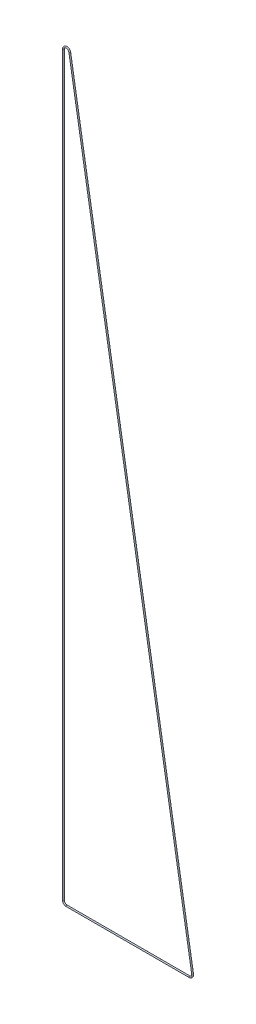
ISO-10303-21;
HEADER;
FILE_DESCRIPTION(('STEP AP214'),'2;1');
FILE_NAME('part.step','',(''),(''),'','','');
FILE_SCHEMA(('AUTOMOTIVE_DESIGN { 1 0 10303 214 1 1 1 1 }'));
ENDSEC;
DATA;
#1=APPLICATION_CONTEXT('core data for automotive mechanical design processes');
#2=APPLICATION_PROTOCOL_DEFINITION('international standard','automotive_design',2000,#1);
#3=PRODUCT_CONTEXT('',#1,'mechanical');
#4=PRODUCT('Part','Part','',(#3));
#5=PRODUCT_RELATED_PRODUCT_CATEGORY('part','',(#4));
#6=PRODUCT_DEFINITION_FORMATION('','',#4);
#7=PRODUCT_DEFINITION_CONTEXT('part definition',#1,'design');
#8=PRODUCT_DEFINITION('design','',#6,#7);
#9=PRODUCT_DEFINITION_SHAPE('','',#8);
#10=(LENGTH_UNIT() NAMED_UNIT(*) SI_UNIT(.MILLI.,.METRE.));
#11=(NAMED_UNIT(*) PLANE_ANGLE_UNIT() SI_UNIT($,.RADIAN.));
#12=(NAMED_UNIT(*) SI_UNIT($,.STERADIAN.) SOLID_ANGLE_UNIT());
#13=UNCERTAINTY_MEASURE_WITH_UNIT(LENGTH_MEASURE(1.E-05),#10,'distance_accuracy_value','');
#14=(GEOMETRIC_REPRESENTATION_CONTEXT(3) GLOBAL_UNCERTAINTY_ASSIGNED_CONTEXT((#13)) GLOBAL_UNIT_ASSIGNED_CONTEXT((#10,
#11,#12)) REPRESENTATION_CONTEXT('',''));
#15=CARTESIAN_POINT('',(0.,0.,0.));
#16=DIRECTION('',(0.,0.,1.));
#17=DIRECTION('',(1.,0.,0.));
#18=AXIS2_PLACEMENT_3D('',#15,#16,#17);
#19=CARTESIAN_POINT('',(388.195395782836,0.,0.));
#20=DIRECTION('',(-1.,0.,0.));
#21=DIRECTION('',(0.,-1.,0.));
#22=AXIS2_PLACEMENT_3D('',#19,#20,#21);
#23=CYLINDRICAL_SURFACE('',#22,2.);
#24=CARTESIAN_POINT('',(388.195395782836,0.,0.));
#25=DIRECTION('',(1.,-1.07555631068124E-12,0.));
#26=DIRECTION('',(0.,0.,-1.));
#27=AXIS2_PLACEMENT_3D('',#24,#25,#26);
#28=CIRCLE('',#27,2.);
#29=CARTESIAN_POINT('',(388.195395782836,-1.99999999999998,0.));
#30=VERTEX_POINT('',#29);
#31=EDGE_CURVE('E38',#30,#30,#28,.T.);
#32=ORIENTED_EDGE('',*,*,#31,.F.);
#33=EDGE_LOOP('',(#32));
#34=FACE_BOUND('',#33,.T.);
#35=CARTESIAN_POINT('',(9.99999999999995,0.,0.));
#36=DIRECTION('',(1.,0.,0.));
#37=DIRECTION('',(0.,0.,-1.));
#38=AXIS2_PLACEMENT_3D('',#35,#36,#37);
#39=CIRCLE('',#38,2.);
#40=CARTESIAN_POINT('',(9.99999999999995,0.,-2.));
#41=VERTEX_POINT('',#40);
#42=EDGE_CURVE('E10',#41,#41,#39,.T.);
#43=ORIENTED_EDGE('',*,*,#42,.T.);
#44=EDGE_LOOP('',(#43));
#45=FACE_BOUND('',#44,.T.);
#46=ADVANCED_FACE('F28',(#34,#45),#23,.T.);
#47=CARTESIAN_POINT('',(388.195395782836,10.,0.));
#48=DIRECTION('',(0.,0.,-1.));
#49=DIRECTION('',(-1.,0.,0.));
#50=AXIS2_PLACEMENT_3D('',#47,#48,#49);
#51=TOROIDAL_SURFACE('',#50,10.,2.);
#52=CARTESIAN_POINT('',(398.059335021158,11.6439898730536,0.));
#53=DIRECTION('',(-0.164398987304308,0.986393923832318,0.));
#54=DIRECTION('',(0.,0.,-1.));
#55=AXIS2_PLACEMENT_3D('',#52,#53,#54);
#56=CIRCLE('',#55,2.);
#57=CARTESIAN_POINT('',(400.032122868822,11.9727878476643,0.));
#58=VERTEX_POINT('',#57);
#59=EDGE_CURVE('E43',#58,#58,#56,.T.);
#60=CARTESIAN_POINT('',(388.195395782836,10.,0.));
#61=DIRECTION('',(0.,0.,-1.));
#62=DIRECTION('',(-1.,0.,0.));
#63=AXIS2_PLACEMENT_3D('',#60,#61,#62);
#64=CIRCLE('',#63,12.);
#65=EDGE_CURVE('',#58,#30,#64,.T.);
#66=ORIENTED_EDGE('',*,*,#59,.F.);
#67=ORIENTED_EDGE('',*,*,#31,.T.);
#68=ORIENTED_EDGE('',*,*,#65,.T.);
#69=ORIENTED_EDGE('',*,*,#65,.F.);
#70=EDGE_LOOP('',(#66,#68,#67,#69));
#71=FACE_BOUND('',#70,.T.);
#72=ADVANCED_FACE('F73',(#71),#51,.T.);
#73=CARTESIAN_POINT('',(19.8639392383222,2280.81636457007,0.));
#74=DIRECTION('',(0.164398987305357,-0.986393923832144,0.));
#75=DIRECTION('',(0.986393923832144,0.164398987305357,0.));
#76=AXIS2_PLACEMENT_3D('',#73,#74,#75);
#77=CYLINDRICAL_SURFACE('',#76,2.);
#78=CARTESIAN_POINT('',(19.8639392383222,2280.81636457007,0.));
#79=DIRECTION('',(-0.164398987304308,0.986393923832318,0.));
#80=DIRECTION('',(0.,0.,-1.));
#81=AXIS2_PLACEMENT_3D('',#78,#79,#80);
#82=CIRCLE('',#81,2.);
#83=CARTESIAN_POINT('',(21.8367270859867,2281.14516254468,0.));
#84=VERTEX_POINT('',#83);
#85=EDGE_CURVE('E48',#84,#84,#82,.T.);
#86=ORIENTED_EDGE('',*,*,#85,.F.);
#87=EDGE_LOOP('',(#86));
#88=FACE_BOUND('',#87,.T.);
#89=ORIENTED_EDGE('',*,*,#59,.T.);
#90=EDGE_LOOP('',(#89));
#91=FACE_BOUND('',#90,.T.);
#92=ADVANCED_FACE('F78',(#88,#91),#77,.T.);
#93=CARTESIAN_POINT('',(10.,2279.17237469702,0.));
#94=DIRECTION('',(0.,0.,-1.));
#95=DIRECTION('',(-1.,0.,0.));
#96=AXIS2_PLACEMENT_3D('',#93,#94,#95);
#97=TOROIDAL_SURFACE('',#96,10.,2.);
#98=CARTESIAN_POINT('',(0.,2279.17237469701,0.));
#99=DIRECTION('',(0.,-1.,0.));
#100=DIRECTION('',(0.,0.,-1.));
#101=AXIS2_PLACEMENT_3D('',#98,#99,#100);
#102=CIRCLE('',#101,2.);
#103=CARTESIAN_POINT('',(-2.,2279.17237469701,0.));
#104=VERTEX_POINT('',#103);
#105=EDGE_CURVE('E94',#104,#104,#102,.T.);
#106=CARTESIAN_POINT('',(10.,2279.17237469702,0.));
#107=DIRECTION('',(0.,0.,-1.));
#108=DIRECTION('',(-1.,0.,0.));
#109=AXIS2_PLACEMENT_3D('',#106,#107,#108);
#110=CIRCLE('',#109,12.);
#111=EDGE_CURVE('',#104,#84,#110,.T.);
#112=ORIENTED_EDGE('',*,*,#105,.F.);
#113=ORIENTED_EDGE('',*,*,#85,.T.);
#114=ORIENTED_EDGE('',*,*,#111,.T.);
#115=ORIENTED_EDGE('',*,*,#111,.F.);
#116=EDGE_LOOP('',(#112,#114,#113,#115));
#117=FACE_BOUND('',#116,.T.);
#118=ADVANCED_FACE('F67',(#117),#97,.T.);
#119=CARTESIAN_POINT('',(0.,10.0000000000001,0.));
#120=DIRECTION('',(0.,1.,0.));
#121=DIRECTION('',(0.,0.,1.));
#122=AXIS2_PLACEMENT_3D('',#119,#120,#121);
#123=CYLINDRICAL_SURFACE('',#122,2.);
#124=CARTESIAN_POINT('',(0.,10.0000000000001,0.));
#125=DIRECTION('',(0.,-1.,0.));
#126=DIRECTION('',(0.,0.,-1.));
#127=AXIS2_PLACEMENT_3D('',#124,#125,#126);
#128=CIRCLE('',#127,2.);
#129=CARTESIAN_POINT('',(0.,10.0000000000001,-2.));
#130=VERTEX_POINT('',#129);
#131=EDGE_CURVE('E97',#130,#130,#128,.T.);
#132=ORIENTED_EDGE('',*,*,#131,.F.);
#133=EDGE_LOOP('',(#132));
#134=FACE_BOUND('',#133,.T.);
#135=ORIENTED_EDGE('',*,*,#105,.T.);
#136=EDGE_LOOP('',(#135));
#137=FACE_BOUND('',#136,.T.);
#138=ADVANCED_FACE('F62',(#134,#137),#123,.T.);
#139=CARTESIAN_POINT('',(10.,10.,0.));
#140=DIRECTION('',(0.,0.,1.));
#141=DIRECTION('',(1.,0.,0.));
#142=AXIS2_PLACEMENT_3D('',#139,#140,#141);
#143=TOROIDAL_SURFACE('',#142,10.,2.);
#144=ORIENTED_EDGE('',*,*,#131,.T.);
#145=EDGE_LOOP('',(#144));
#146=FACE_BOUND('',#145,.T.);
#147=ORIENTED_EDGE('',*,*,#42,.F.);
#148=EDGE_LOOP('',(#147));
#149=FACE_BOUND('',#148,.T.);
#150=ADVANCED_FACE('F60',(#146,#149),#143,.T.);
#151=CLOSED_SHELL('',(#46,#72,#92,#118,#138,#150));
#152=MANIFOLD_SOLID_BREP('B2',#151);
#153=ADVANCED_BREP_SHAPE_REPRESENTATION('',(#18,#152),#14);
#154=SHAPE_DEFINITION_REPRESENTATION(#9,#153);
ENDSEC;
END-ISO-10303-21;
